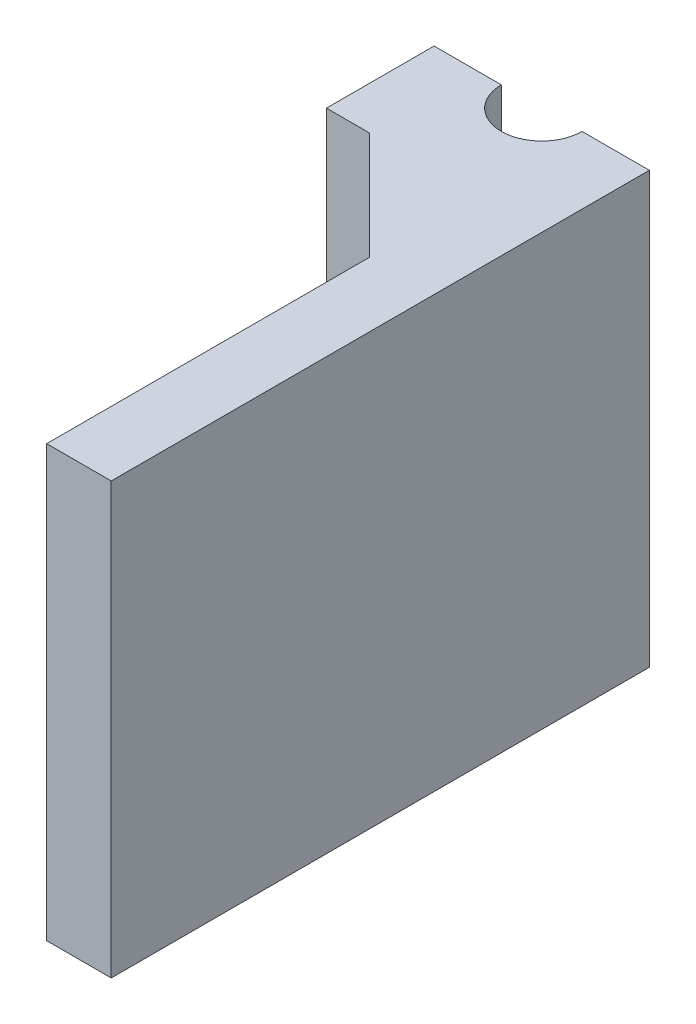
ISO-10303-21;
HEADER;
FILE_DESCRIPTION(('STEP AP214'),'2;1');
FILE_NAME('part.step','',(''),(''),'','','');
FILE_SCHEMA(('AUTOMOTIVE_DESIGN { 1 0 10303 214 1 1 1 1 }'));
ENDSEC;
DATA;
#1=APPLICATION_CONTEXT('core data for automotive mechanical design processes');
#2=APPLICATION_PROTOCOL_DEFINITION('international standard','automotive_design',2000,#1);
#3=PRODUCT_CONTEXT('',#1,'mechanical');
#4=PRODUCT('Part','Part','',(#3));
#5=PRODUCT_RELATED_PRODUCT_CATEGORY('part','',(#4));
#6=PRODUCT_DEFINITION_FORMATION('','',#4);
#7=PRODUCT_DEFINITION_CONTEXT('part definition',#1,'design');
#8=PRODUCT_DEFINITION('design','',#6,#7);
#9=PRODUCT_DEFINITION_SHAPE('','',#8);
#10=(LENGTH_UNIT() NAMED_UNIT(*) SI_UNIT(.MILLI.,.METRE.));
#11=(NAMED_UNIT(*) PLANE_ANGLE_UNIT() SI_UNIT($,.RADIAN.));
#12=(NAMED_UNIT(*) SI_UNIT($,.STERADIAN.) SOLID_ANGLE_UNIT());
#13=UNCERTAINTY_MEASURE_WITH_UNIT(LENGTH_MEASURE(1.E-05),#10,'distance_accuracy_value','');
#14=(GEOMETRIC_REPRESENTATION_CONTEXT(3) GLOBAL_UNCERTAINTY_ASSIGNED_CONTEXT((#13)) GLOBAL_UNIT_ASSIGNED_CONTEXT((#10,
#11,#12)) REPRESENTATION_CONTEXT('',''));
#15=CARTESIAN_POINT('',(0.,0.,0.));
#16=DIRECTION('',(0.,0.,1.));
#17=DIRECTION('',(1.,0.,0.));
#18=AXIS2_PLACEMENT_3D('',#15,#16,#17);
#19=CARTESIAN_POINT('',(0.,-10.,3.88));
#20=DIRECTION('',(0.,0.,-1.));
#21=DIRECTION('',(-1.,0.,0.));
#22=AXIS2_PLACEMENT_3D('',#19,#20,#21);
#23=PLANE('',#22);
#24=DIRECTION('',(-1.,0.,0.));
#25=VECTOR('',#24,1.);
#26=CARTESIAN_POINT('',(0.,-10.,3.88));
#27=LINE('',#26,#25);
#28=CARTESIAN_POINT('',(2.00000000000003,-10.,3.88));
#29=VERTEX_POINT('',#28);
#30=CARTESIAN_POINT('',(0.,-10.,3.88));
#31=VERTEX_POINT('',#30);
#32=EDGE_CURVE('E256',#29,#31,#27,.T.);
#33=ORIENTED_EDGE('',*,*,#32,.F.);
#34=DIRECTION('',(0.,1.,0.));
#35=VECTOR('',#34,1.);
#36=CARTESIAN_POINT('',(2.00000000000003,9.99999999999999,3.88));
#37=LINE('',#36,#35);
#38=CARTESIAN_POINT('',(2.00000000000003,9.99999999999999,3.88));
#39=VERTEX_POINT('',#38);
#40=EDGE_CURVE('E131',#29,#39,#37,.T.);
#41=ORIENTED_EDGE('',*,*,#40,.T.);
#42=DIRECTION('',(1.,0.,0.));
#43=VECTOR('',#42,1.);
#44=CARTESIAN_POINT('',(10.,9.99999999999999,3.88));
#45=LINE('',#44,#43);
#46=CARTESIAN_POINT('',(0.,9.99999999999999,3.88));
#47=VERTEX_POINT('',#46);
#48=EDGE_CURVE('E313',#47,#39,#45,.T.);
#49=ORIENTED_EDGE('',*,*,#48,.F.);
#50=DIRECTION('',(0.,1.,0.));
#51=VECTOR('',#50,1.);
#52=CARTESIAN_POINT('',(0.,-10.,3.88));
#53=LINE('',#52,#51);
#54=EDGE_CURVE('E266',#31,#47,#53,.T.);
#55=ORIENTED_EDGE('',*,*,#54,.F.);
#56=EDGE_LOOP('',(#33,#41,#49,#55));
#57=FACE_BOUND('',#56,.T.);
#58=ADVANCED_FACE('F108',(#57),#23,.F.);
#59=CARTESIAN_POINT('',(10.,2.5,0.));
#60=DIRECTION('',(0.,1.,0.));
#61=DIRECTION('',(0.,0.,1.));
#62=AXIS2_PLACEMENT_3D('',#59,#60,#61);
#63=PLANE('',#62);
#64=DIRECTION('',(-1.,0.,0.));
#65=VECTOR('',#64,1.);
#66=CARTESIAN_POINT('',(10.,2.5,-1.12));
#67=LINE('',#66,#65);
#68=CARTESIAN_POINT('',(3.125,2.5,-1.12));
#69=VERTEX_POINT('',#68);
#70=CARTESIAN_POINT('',(2.,2.5,-1.12));
#71=VERTEX_POINT('',#70);
#72=EDGE_CURVE('E307',#69,#71,#67,.T.);
#73=ORIENTED_EDGE('',*,*,#72,.F.);
#74=CARTESIAN_POINT('',(5.,2.5,-1.12));
#75=DIRECTION('',(0.,1.,0.));
#76=DIRECTION('',(0.,0.,1.));
#77=AXIS2_PLACEMENT_3D('',#74,#75,#76);
#78=CIRCLE('',#77,1.875);
#79=CARTESIAN_POINT('',(6.875,2.5,-1.12));
#80=VERTEX_POINT('',#79);
#81=EDGE_CURVE('E321',#69,#80,#78,.T.);
#82=ORIENTED_EDGE('',*,*,#81,.T.);
#83=DIRECTION('',(1.,0.,0.));
#84=VECTOR('',#83,1.);
#85=CARTESIAN_POINT('',(10.,2.5,-1.12));
#86=LINE('',#85,#84);
#87=CARTESIAN_POINT('',(8.,2.5,-1.12));
#88=VERTEX_POINT('',#87);
#89=EDGE_CURVE('E293',#80,#88,#86,.T.);
#90=ORIENTED_EDGE('',*,*,#89,.T.);
#91=DIRECTION('',(0.,0.,-1.));
#92=VECTOR('',#91,1.);
#93=CARTESIAN_POINT('',(8.,2.5,1.88));
#94=LINE('',#93,#92);
#95=CARTESIAN_POINT('',(8.,2.5,1.88));
#96=VERTEX_POINT('',#95);
#97=EDGE_CURVE('E347',#96,#88,#94,.T.);
#98=ORIENTED_EDGE('',*,*,#97,.F.);
#99=DIRECTION('',(1.,0.,0.));
#100=VECTOR('',#99,1.);
#101=CARTESIAN_POINT('',(2.,2.5,1.88));
#102=LINE('',#101,#100);
#103=CARTESIAN_POINT('',(2.,2.5,1.88));
#104=VERTEX_POINT('',#103);
#105=EDGE_CURVE('E333',#104,#96,#102,.T.);
#106=ORIENTED_EDGE('',*,*,#105,.F.);
#107=DIRECTION('',(0.,0.,-1.));
#108=VECTOR('',#107,1.);
#109=CARTESIAN_POINT('',(2.,2.5,1.88));
#110=LINE('',#109,#108);
#111=EDGE_CURVE('E351',#104,#71,#110,.T.);
#112=ORIENTED_EDGE('',*,*,#111,.T.);
#113=EDGE_LOOP('',(#73,#82,#90,#98,#106,#112));
#114=FACE_BOUND('',#113,.T.);
#115=ADVANCED_FACE('F410',(#114),#63,.F.);
#116=CARTESIAN_POINT('',(10.,9.99999999999999,0.));
#117=DIRECTION('',(0.,-1.,0.));
#118=DIRECTION('',(0.,0.,-1.));
#119=AXIS2_PLACEMENT_3D('',#116,#117,#118);
#120=PLANE('',#119);
#121=DIRECTION('',(0.,0.,1.));
#122=VECTOR('',#121,1.);
#123=CARTESIAN_POINT('',(0.,9.99999999999999,0.));
#124=LINE('',#123,#122);
#125=CARTESIAN_POINT('',(0.,9.99999999999999,-1.12));
#126=VERTEX_POINT('',#125);
#127=EDGE_CURVE('E346',#126,#47,#124,.T.);
#128=ORIENTED_EDGE('',*,*,#127,.T.);
#129=ORIENTED_EDGE('',*,*,#48,.T.);
#130=DIRECTION('',(-0.707106781186544,0.,-0.707106781186551));
#131=VECTOR('',#130,1.);
#132=CARTESIAN_POINT('',(4.05999999999997,9.99999999999999,5.93999999999996));
#133=LINE('',#132,#131);
#134=CARTESIAN_POINT('',(7.,9.99999999999999,8.88000000000003));
#135=VERTEX_POINT('',#134);
#136=EDGE_CURVE('E13',#39,#135,#133,.F.);
#137=ORIENTED_EDGE('',*,*,#136,.T.);
#138=DIRECTION('',(0.,0.,-1.));
#139=VECTOR('',#138,1.);
#140=CARTESIAN_POINT('',(7.,9.99999999999999,23.88));
#141=LINE('',#140,#139);
#142=CARTESIAN_POINT('',(7.,9.99999999999999,23.88));
#143=VERTEX_POINT('',#142);
#144=EDGE_CURVE('E234',#143,#135,#141,.T.);
#145=ORIENTED_EDGE('',*,*,#144,.F.);
#146=DIRECTION('',(-1.,0.,0.));
#147=VECTOR('',#146,1.);
#148=CARTESIAN_POINT('',(10.,9.99999999999999,23.88));
#149=LINE('',#148,#147);
#150=CARTESIAN_POINT('',(10.,9.99999999999999,23.88));
#151=VERTEX_POINT('',#150);
#152=EDGE_CURVE('E230',#151,#143,#149,.T.);
#153=ORIENTED_EDGE('',*,*,#152,.F.);
#154=DIRECTION('',(0.,0.,1.));
#155=VECTOR('',#154,1.);
#156=CARTESIAN_POINT('',(10.,9.99999999999999,0.));
#157=LINE('',#156,#155);
#158=CARTESIAN_POINT('',(10.,9.99999999999999,-1.12));
#159=VERTEX_POINT('',#158);
#160=EDGE_CURVE('E216',#159,#151,#157,.T.);
#161=ORIENTED_EDGE('',*,*,#160,.F.);
#162=DIRECTION('',(-1.,0.,0.));
#163=VECTOR('',#162,1.);
#164=CARTESIAN_POINT('',(10.,9.99999999999999,-1.12));
#165=LINE('',#164,#163);
#166=CARTESIAN_POINT('',(6.875,9.99999999999999,-1.12));
#167=VERTEX_POINT('',#166);
#168=EDGE_CURVE('E297',#159,#167,#165,.T.);
#169=ORIENTED_EDGE('',*,*,#168,.T.);
#170=CARTESIAN_POINT('',(5.,9.99999999999999,-1.12));
#171=DIRECTION('',(0.,-1.,0.));
#172=DIRECTION('',(0.,0.,-1.));
#173=AXIS2_PLACEMENT_3D('',#170,#171,#172);
#174=CIRCLE('',#173,1.875);
#175=CARTESIAN_POINT('',(3.125,9.99999999999999,-1.12));
#176=VERTEX_POINT('',#175);
#177=EDGE_CURVE('E320',#167,#176,#174,.T.);
#178=ORIENTED_EDGE('',*,*,#177,.T.);
#179=DIRECTION('',(1.,0.,0.));
#180=VECTOR('',#179,1.);
#181=CARTESIAN_POINT('',(10.,9.99999999999999,-1.12));
#182=LINE('',#181,#180);
#183=EDGE_CURVE('E310',#126,#176,#182,.T.);
#184=ORIENTED_EDGE('',*,*,#183,.F.);
#185=EDGE_LOOP('',(#128,#129,#137,#145,#153,#161,#169,#178,#184));
#186=FACE_BOUND('',#185,.T.);
#187=ADVANCED_FACE('F232',(#186),#120,.F.);
#188=CARTESIAN_POINT('',(10.,-10.,0.));
#189=DIRECTION('',(0.,-1.,0.));
#190=DIRECTION('',(0.,0.,-1.));
#191=AXIS2_PLACEMENT_3D('',#188,#189,#190);
#192=PLANE('',#191);
#193=DIRECTION('',(0.,0.,1.));
#194=VECTOR('',#193,1.);
#195=CARTESIAN_POINT('',(10.,-10.,0.));
#196=LINE('',#195,#194);
#197=CARTESIAN_POINT('',(10.,-10.,-1.12));
#198=VERTEX_POINT('',#197);
#199=CARTESIAN_POINT('',(10.,-10.,23.88));
#200=VERTEX_POINT('',#199);
#201=EDGE_CURVE('E226',#198,#200,#196,.T.);
#202=ORIENTED_EDGE('',*,*,#201,.T.);
#203=DIRECTION('',(1.,0.,0.));
#204=VECTOR('',#203,1.);
#205=CARTESIAN_POINT('',(10.,-10.,23.88));
#206=LINE('',#205,#204);
#207=CARTESIAN_POINT('',(7.,-10.,23.88));
#208=VERTEX_POINT('',#207);
#209=EDGE_CURVE('E243',#208,#200,#206,.T.);
#210=ORIENTED_EDGE('',*,*,#209,.F.);
#211=DIRECTION('',(0.,0.,-1.));
#212=VECTOR('',#211,1.);
#213=CARTESIAN_POINT('',(7.,-10.,23.88));
#214=LINE('',#213,#212);
#215=CARTESIAN_POINT('',(7.,-10.,8.88000000000003));
#216=VERTEX_POINT('',#215);
#217=EDGE_CURVE('E251',#208,#216,#214,.T.);
#218=ORIENTED_EDGE('',*,*,#217,.T.);
#219=DIRECTION('',(0.707106781186544,0.,0.707106781186551));
#220=VECTOR('',#219,1.);
#221=CARTESIAN_POINT('',(7.,-10.,8.88000000000003));
#222=LINE('',#221,#220);
#223=EDGE_CURVE('E118',#216,#29,#222,.F.);
#224=ORIENTED_EDGE('',*,*,#223,.T.);
#225=ORIENTED_EDGE('',*,*,#32,.T.);
#226=DIRECTION('',(0.,0.,1.));
#227=VECTOR('',#226,1.);
#228=CARTESIAN_POINT('',(0.,-10.,0.));
#229=LINE('',#228,#227);
#230=CARTESIAN_POINT('',(0.,-10.,-1.12));
#231=VERTEX_POINT('',#230);
#232=EDGE_CURVE('E227',#231,#31,#229,.T.);
#233=ORIENTED_EDGE('',*,*,#232,.F.);
#234=DIRECTION('',(-1.,0.,0.));
#235=VECTOR('',#234,1.);
#236=CARTESIAN_POINT('',(0.,-10.,-1.12));
#237=LINE('',#236,#235);
#238=CARTESIAN_POINT('',(3.125,-10.,-1.12));
#239=VERTEX_POINT('',#238);
#240=EDGE_CURVE('E263',#239,#231,#237,.T.);
#241=ORIENTED_EDGE('',*,*,#240,.F.);
#242=CARTESIAN_POINT('',(5.,-10.,-1.12));
#243=DIRECTION('',(0.,-1.,0.));
#244=DIRECTION('',(0.,0.,-1.));
#245=AXIS2_PLACEMENT_3D('',#242,#243,#244);
#246=CIRCLE('',#245,1.875);
#247=CARTESIAN_POINT('',(6.875,-10.,-1.12));
#248=VERTEX_POINT('',#247);
#249=EDGE_CURVE('E316',#248,#239,#246,.T.);
#250=ORIENTED_EDGE('',*,*,#249,.F.);
#251=DIRECTION('',(1.,0.,0.));
#252=VECTOR('',#251,1.);
#253=CARTESIAN_POINT('',(0.,-10.,-1.12));
#254=LINE('',#253,#252);
#255=EDGE_CURVE('E259',#248,#198,#254,.T.);
#256=ORIENTED_EDGE('',*,*,#255,.T.);
#257=EDGE_LOOP('',(#202,#210,#218,#224,#225,#233,#241,#250,#256));
#258=FACE_BOUND('',#257,.T.);
#259=ADVANCED_FACE('F390',(#258),#192,.T.);
#260=CARTESIAN_POINT('',(10.,-2.5,0.));
#261=DIRECTION('',(0.,1.,0.));
#262=DIRECTION('',(0.,0.,1.));
#263=AXIS2_PLACEMENT_3D('',#260,#261,#262);
#264=PLANE('',#263);
#265=CARTESIAN_POINT('',(5.,-2.5,-1.12));
#266=DIRECTION('',(0.,1.,0.));
#267=DIRECTION('',(0.,0.,1.));
#268=AXIS2_PLACEMENT_3D('',#265,#266,#267);
#269=CIRCLE('',#268,1.875);
#270=CARTESIAN_POINT('',(3.125,-2.5,-1.12));
#271=VERTEX_POINT('',#270);
#272=CARTESIAN_POINT('',(6.875,-2.5,-1.12));
#273=VERTEX_POINT('',#272);
#274=EDGE_CURVE('E326',#271,#273,#269,.T.);
#275=ORIENTED_EDGE('',*,*,#274,.F.);
#276=DIRECTION('',(-1.,0.,0.));
#277=VECTOR('',#276,1.);
#278=CARTESIAN_POINT('',(10.,-2.5,-1.12));
#279=LINE('',#278,#277);
#280=CARTESIAN_POINT('',(2.,-2.5,-1.12));
#281=VERTEX_POINT('',#280);
#282=EDGE_CURVE('E303',#271,#281,#279,.T.);
#283=ORIENTED_EDGE('',*,*,#282,.T.);
#284=DIRECTION('',(0.,0.,-1.));
#285=VECTOR('',#284,1.);
#286=CARTESIAN_POINT('',(2.,-2.5,1.88));
#287=LINE('',#286,#285);
#288=CARTESIAN_POINT('',(2.,-2.5,1.88));
#289=VERTEX_POINT('',#288);
#290=EDGE_CURVE('E341',#289,#281,#287,.T.);
#291=ORIENTED_EDGE('',*,*,#290,.F.);
#292=DIRECTION('',(-1.,0.,0.));
#293=VECTOR('',#292,1.);
#294=CARTESIAN_POINT('',(8.,-2.5,1.88));
#295=LINE('',#294,#293);
#296=CARTESIAN_POINT('',(8.,-2.5,1.88));
#297=VERTEX_POINT('',#296);
#298=EDGE_CURVE('E325',#297,#289,#295,.T.);
#299=ORIENTED_EDGE('',*,*,#298,.F.);
#300=DIRECTION('',(0.,0.,-1.));
#301=VECTOR('',#300,1.);
#302=CARTESIAN_POINT('',(8.,-2.5,1.88));
#303=LINE('',#302,#301);
#304=CARTESIAN_POINT('',(8.,-2.5,-1.12));
#305=VERTEX_POINT('',#304);
#306=EDGE_CURVE('E342',#297,#305,#303,.T.);
#307=ORIENTED_EDGE('',*,*,#306,.T.);
#308=DIRECTION('',(1.,0.,0.));
#309=VECTOR('',#308,1.);
#310=CARTESIAN_POINT('',(10.,-2.5,-1.12));
#311=LINE('',#310,#309);
#312=EDGE_CURVE('E290',#273,#305,#311,.T.);
#313=ORIENTED_EDGE('',*,*,#312,.F.);
#314=EDGE_LOOP('',(#275,#283,#291,#299,#307,#313));
#315=FACE_BOUND('',#314,.T.);
#316=ADVANCED_FACE('F401',(#315),#264,.T.);
#317=CARTESIAN_POINT('',(0.,0.,0.));
#318=DIRECTION('',(1.,0.,0.));
#319=DIRECTION('',(0.,0.,-1.));
#320=AXIS2_PLACEMENT_3D('',#317,#318,#319);
#321=PLANE('',#320);
#322=ORIENTED_EDGE('',*,*,#232,.T.);
#323=ORIENTED_EDGE('',*,*,#54,.T.);
#324=ORIENTED_EDGE('',*,*,#127,.F.);
#325=DIRECTION('',(0.,1.,0.));
#326=VECTOR('',#325,1.);
#327=CARTESIAN_POINT('',(0.,-10.,-1.12));
#328=LINE('',#327,#326);
#329=EDGE_CURVE('E271',#231,#126,#328,.T.);
#330=ORIENTED_EDGE('',*,*,#329,.F.);
#331=EDGE_LOOP('',(#322,#323,#324,#330));
#332=FACE_BOUND('',#331,.T.);
#333=ADVANCED_FACE('F427',(#332),#321,.F.);
#334=CARTESIAN_POINT('',(2.,-2.5,1.88));
#335=DIRECTION('',(-1.,0.,0.));
#336=DIRECTION('',(0.,0.,1.));
#337=AXIS2_PLACEMENT_3D('',#334,#335,#336);
#338=PLANE('',#337);
#339=DIRECTION('',(0.,-1.,0.));
#340=VECTOR('',#339,1.);
#341=CARTESIAN_POINT('',(2.,-2.5,-1.12));
#342=LINE('',#341,#340);
#343=EDGE_CURVE('E300',#71,#281,#342,.T.);
#344=ORIENTED_EDGE('',*,*,#343,.F.);
#345=ORIENTED_EDGE('',*,*,#111,.F.);
#346=DIRECTION('',(0.,1.,0.));
#347=VECTOR('',#346,1.);
#348=CARTESIAN_POINT('',(2.,-2.5,1.88));
#349=LINE('',#348,#347);
#350=EDGE_CURVE('E329',#289,#104,#349,.T.);
#351=ORIENTED_EDGE('',*,*,#350,.F.);
#352=ORIENTED_EDGE('',*,*,#290,.T.);
#353=EDGE_LOOP('',(#344,#345,#351,#352));
#354=FACE_BOUND('',#353,.T.);
#355=ADVANCED_FACE('F416',(#354),#338,.F.);
#356=CARTESIAN_POINT('',(5.,9.99999999999999,-1.12));
#357=DIRECTION('',(0.,-1.,0.));
#358=DIRECTION('',(0.,0.,-1.));
#359=AXIS2_PLACEMENT_3D('',#356,#357,#358);
#360=CYLINDRICAL_SURFACE('',#359,1.875);
#361=DIRECTION('',(0.,1.,0.));
#362=VECTOR('',#361,1.);
#363=CARTESIAN_POINT('',(3.125,-10.,-1.12));
#364=LINE('',#363,#362);
#365=EDGE_CURVE('E274',#239,#271,#364,.T.);
#366=ORIENTED_EDGE('',*,*,#365,.T.);
#367=ORIENTED_EDGE('',*,*,#274,.T.);
#368=DIRECTION('',(0.,1.,0.));
#369=VECTOR('',#368,1.);
#370=CARTESIAN_POINT('',(6.875,-10.,-1.12));
#371=LINE('',#370,#369);
#372=EDGE_CURVE('E277',#248,#273,#371,.T.);
#373=ORIENTED_EDGE('',*,*,#372,.F.);
#374=ORIENTED_EDGE('',*,*,#249,.T.);
#375=EDGE_LOOP('',(#366,#367,#373,#374));
#376=FACE_BOUND('',#375,.T.);
#377=ADVANCED_FACE('F398',(#376),#360,.F.);
#378=DIRECTION('',(0.,-1.,0.));
#379=VECTOR('',#378,1.);
#380=CARTESIAN_POINT('',(3.125,9.99999999999999,-1.12));
#381=LINE('',#380,#379);
#382=EDGE_CURVE('E372',#176,#69,#381,.T.);
#383=ORIENTED_EDGE('',*,*,#382,.F.);
#384=ORIENTED_EDGE('',*,*,#177,.F.);
#385=DIRECTION('',(0.,-1.,0.));
#386=VECTOR('',#385,1.);
#387=CARTESIAN_POINT('',(6.875,9.99999999999999,-1.12));
#388=LINE('',#387,#386);
#389=EDGE_CURVE('E360',#167,#80,#388,.T.);
#390=ORIENTED_EDGE('',*,*,#389,.T.);
#391=ORIENTED_EDGE('',*,*,#81,.F.);
#392=EDGE_LOOP('',(#383,#384,#390,#391));
#393=FACE_BOUND('',#392,.T.);
#394=ADVANCED_FACE('F421',(#393),#360,.F.);
#395=CARTESIAN_POINT('',(10.,0.,0.));
#396=DIRECTION('',(1.,0.,0.));
#397=DIRECTION('',(0.,0.,-1.));
#398=AXIS2_PLACEMENT_3D('',#395,#396,#397);
#399=PLANE('',#398);
#400=ORIENTED_EDGE('',*,*,#160,.T.);
#401=DIRECTION('',(0.,1.,0.));
#402=VECTOR('',#401,1.);
#403=CARTESIAN_POINT('',(10.,9.99999999999999,23.88));
#404=LINE('',#403,#402);
#405=EDGE_CURVE('E221',#200,#151,#404,.T.);
#406=ORIENTED_EDGE('',*,*,#405,.F.);
#407=ORIENTED_EDGE('',*,*,#201,.F.);
#408=DIRECTION('',(0.,1.,0.));
#409=VECTOR('',#408,1.);
#410=CARTESIAN_POINT('',(10.,-10.,-1.12));
#411=LINE('',#410,#409);
#412=EDGE_CURVE('E222',#198,#159,#411,.T.);
#413=ORIENTED_EDGE('',*,*,#412,.T.);
#414=EDGE_LOOP('',(#400,#406,#407,#413));
#415=FACE_BOUND('',#414,.T.);
#416=ADVANCED_FACE('F218',(#415),#399,.T.);
#417=CARTESIAN_POINT('',(8.,2.5,1.88));
#418=DIRECTION('',(1.,0.,0.));
#419=DIRECTION('',(0.,0.,-1.));
#420=AXIS2_PLACEMENT_3D('',#417,#418,#419);
#421=PLANE('',#420);
#422=ORIENTED_EDGE('',*,*,#97,.T.);
#423=DIRECTION('',(0.,-1.,0.));
#424=VECTOR('',#423,1.);
#425=CARTESIAN_POINT('',(8.,2.5,-1.12));
#426=LINE('',#425,#424);
#427=EDGE_CURVE('E270',#88,#305,#426,.T.);
#428=ORIENTED_EDGE('',*,*,#427,.T.);
#429=ORIENTED_EDGE('',*,*,#306,.F.);
#430=DIRECTION('',(0.,-1.,0.));
#431=VECTOR('',#430,1.);
#432=CARTESIAN_POINT('',(8.,2.5,1.88));
#433=LINE('',#432,#431);
#434=EDGE_CURVE('E337',#96,#297,#433,.T.);
#435=ORIENTED_EDGE('',*,*,#434,.F.);
#436=EDGE_LOOP('',(#422,#428,#429,#435));
#437=FACE_BOUND('',#436,.T.);
#438=ADVANCED_FACE('F405',(#437),#421,.F.);
#439=CARTESIAN_POINT('',(0.,0.,1.88));
#440=DIRECTION('',(0.,0.,-1.));
#441=DIRECTION('',(-1.,0.,0.));
#442=AXIS2_PLACEMENT_3D('',#439,#440,#441);
#443=PLANE('',#442);
#444=ORIENTED_EDGE('',*,*,#298,.T.);
#445=ORIENTED_EDGE('',*,*,#350,.T.);
#446=ORIENTED_EDGE('',*,*,#105,.T.);
#447=ORIENTED_EDGE('',*,*,#434,.T.);
#448=EDGE_LOOP('',(#444,#445,#446,#447));
#449=FACE_BOUND('',#448,.T.);
#450=ADVANCED_FACE('F412',(#449),#443,.T.);
#451=CARTESIAN_POINT('',(0.,-10.,-1.12));
#452=DIRECTION('',(0.,0.,1.));
#453=DIRECTION('',(1.,0.,0.));
#454=AXIS2_PLACEMENT_3D('',#451,#452,#453);
#455=PLANE('',#454);
#456=ORIENTED_EDGE('',*,*,#412,.F.);
#457=ORIENTED_EDGE('',*,*,#255,.F.);
#458=ORIENTED_EDGE('',*,*,#372,.T.);
#459=ORIENTED_EDGE('',*,*,#312,.T.);
#460=ORIENTED_EDGE('',*,*,#427,.F.);
#461=ORIENTED_EDGE('',*,*,#89,.F.);
#462=ORIENTED_EDGE('',*,*,#389,.F.);
#463=ORIENTED_EDGE('',*,*,#168,.F.);
#464=EDGE_LOOP('',(#456,#457,#458,#459,#460,#461,#462,#463));
#465=FACE_BOUND('',#464,.T.);
#466=ADVANCED_FACE('F395',(#465),#455,.F.);
#467=CARTESIAN_POINT('',(0.,-10.,-1.12));
#468=DIRECTION('',(0.,0.,-1.));
#469=DIRECTION('',(-1.,0.,0.));
#470=AXIS2_PLACEMENT_3D('',#467,#468,#469);
#471=PLANE('',#470);
#472=ORIENTED_EDGE('',*,*,#183,.T.);
#473=ORIENTED_EDGE('',*,*,#382,.T.);
#474=ORIENTED_EDGE('',*,*,#72,.T.);
#475=ORIENTED_EDGE('',*,*,#343,.T.);
#476=ORIENTED_EDGE('',*,*,#282,.F.);
#477=ORIENTED_EDGE('',*,*,#365,.F.);
#478=ORIENTED_EDGE('',*,*,#240,.T.);
#479=ORIENTED_EDGE('',*,*,#329,.T.);
#480=EDGE_LOOP('',(#472,#473,#474,#475,#476,#477,#478,#479));
#481=FACE_BOUND('',#480,.T.);
#482=ADVANCED_FACE('F475',(#481),#471,.T.);
#483=CARTESIAN_POINT('',(7.,9.99999999999999,23.88));
#484=DIRECTION('',(1.,0.,0.));
#485=DIRECTION('',(0.,1.,0.));
#486=AXIS2_PLACEMENT_3D('',#483,#484,#485);
#487=PLANE('',#486);
#488=ORIENTED_EDGE('',*,*,#144,.T.);
#489=DIRECTION('',(0.,-1.,0.));
#490=VECTOR('',#489,1.);
#491=CARTESIAN_POINT('',(7.,-10.,8.88000000000003));
#492=LINE('',#491,#490);
#493=EDGE_CURVE('E375',#135,#216,#492,.T.);
#494=ORIENTED_EDGE('',*,*,#493,.T.);
#495=ORIENTED_EDGE('',*,*,#217,.F.);
#496=DIRECTION('',(0.,-1.,0.));
#497=VECTOR('',#496,1.);
#498=CARTESIAN_POINT('',(7.,9.99999999999999,23.88));
#499=LINE('',#498,#497);
#500=EDGE_CURVE('E238',#143,#208,#499,.T.);
#501=ORIENTED_EDGE('',*,*,#500,.F.);
#502=EDGE_LOOP('',(#488,#494,#495,#501));
#503=FACE_BOUND('',#502,.T.);
#504=ADVANCED_FACE('F387',(#503),#487,.F.);
#505=CARTESIAN_POINT('',(0.,0.,23.88));
#506=DIRECTION('',(0.,0.,-1.));
#507=DIRECTION('',(-1.,0.,0.));
#508=AXIS2_PLACEMENT_3D('',#505,#506,#507);
#509=PLANE('',#508);
#510=ORIENTED_EDGE('',*,*,#405,.T.);
#511=ORIENTED_EDGE('',*,*,#152,.T.);
#512=ORIENTED_EDGE('',*,*,#500,.T.);
#513=ORIENTED_EDGE('',*,*,#209,.T.);
#514=EDGE_LOOP('',(#510,#511,#512,#513));
#515=FACE_BOUND('',#514,.T.);
#516=ADVANCED_FACE('F241',(#515),#509,.F.);
#517=CARTESIAN_POINT('',(7.,9.99999999999999,8.88000000000003));
#518=DIRECTION('',(-0.707106781186551,0.,0.707106781186544));
#519=DIRECTION('',(0.,1.,0.));
#520=AXIS2_PLACEMENT_3D('',#517,#518,#519);
#521=PLANE('',#520);
#522=ORIENTED_EDGE('',*,*,#136,.F.);
#523=ORIENTED_EDGE('',*,*,#40,.F.);
#524=ORIENTED_EDGE('',*,*,#223,.F.);
#525=ORIENTED_EDGE('',*,*,#493,.F.);
#526=EDGE_LOOP('',(#522,#523,#524,#525));
#527=FACE_BOUND('',#526,.T.);
#528=ADVANCED_FACE('F111',(#527),#521,.T.);
#529=CLOSED_SHELL('',(#58,#115,#187,#259,#316,#333,#355,#377,#394,#416,#438,#450,#466,#482,#504,
#516,#528));
#530=MANIFOLD_SOLID_BREP('B2',#529);
#531=ADVANCED_BREP_SHAPE_REPRESENTATION('',(#18,#530),#14);
#532=SHAPE_DEFINITION_REPRESENTATION(#9,#531);
ENDSEC;
END-ISO-10303-21;
